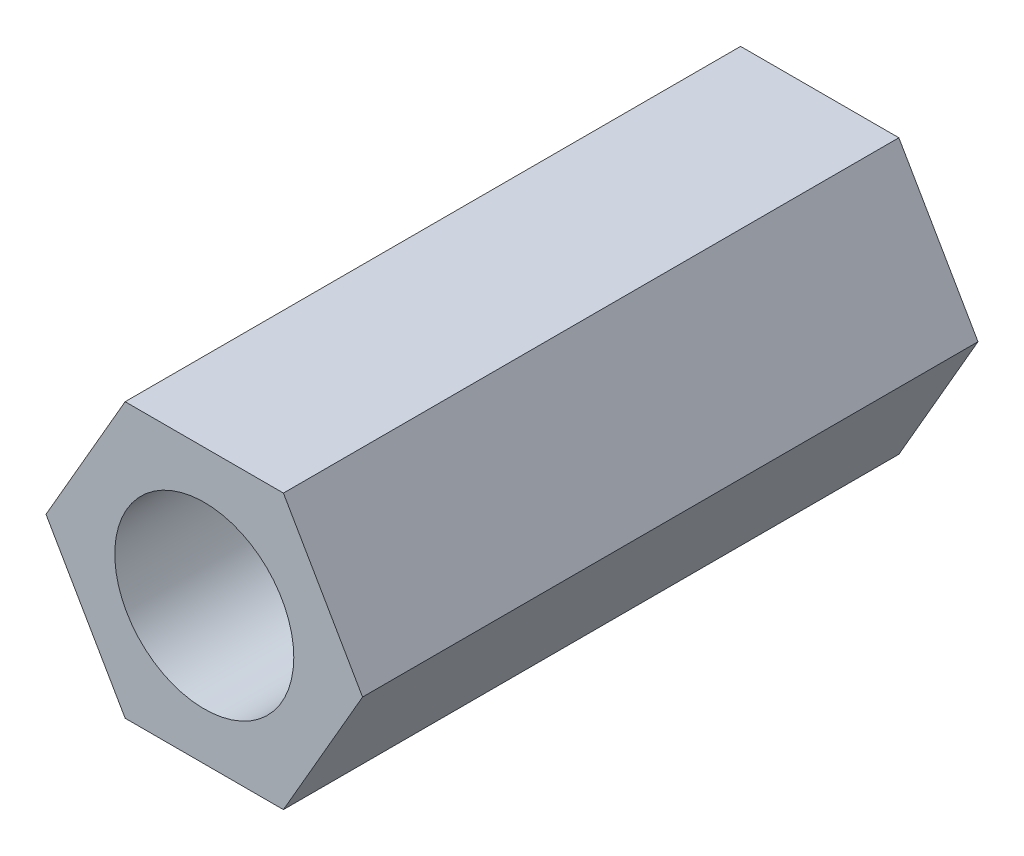
ISO-10303-21;
HEADER;
FILE_DESCRIPTION(('STEP AP214'),'2;1');
FILE_NAME('part.step','',(''),(''),'','','');
FILE_SCHEMA(('AUTOMOTIVE_DESIGN { 1 0 10303 214 1 1 1 1 }'));
ENDSEC;
DATA;
#1=APPLICATION_CONTEXT('core data for automotive mechanical design processes');
#2=APPLICATION_PROTOCOL_DEFINITION('international standard','automotive_design',2000,#1);
#3=PRODUCT_CONTEXT('',#1,'mechanical');
#4=PRODUCT('Part','Part','',(#3));
#5=PRODUCT_RELATED_PRODUCT_CATEGORY('part','',(#4));
#6=PRODUCT_DEFINITION_FORMATION('','',#4);
#7=PRODUCT_DEFINITION_CONTEXT('part definition',#1,'design');
#8=PRODUCT_DEFINITION('design','',#6,#7);
#9=PRODUCT_DEFINITION_SHAPE('','',#8);
#10=(LENGTH_UNIT() NAMED_UNIT(*) SI_UNIT(.MILLI.,.METRE.));
#11=(NAMED_UNIT(*) PLANE_ANGLE_UNIT() SI_UNIT($,.RADIAN.));
#12=(NAMED_UNIT(*) SI_UNIT($,.STERADIAN.) SOLID_ANGLE_UNIT());
#13=UNCERTAINTY_MEASURE_WITH_UNIT(LENGTH_MEASURE(1.E-05),#10,'distance_accuracy_value','');
#14=(GEOMETRIC_REPRESENTATION_CONTEXT(3) GLOBAL_UNCERTAINTY_ASSIGNED_CONTEXT((#13)) GLOBAL_UNIT_ASSIGNED_CONTEXT((#10,
#11,#12)) REPRESENTATION_CONTEXT('',''));
#15=CARTESIAN_POINT('',(0.,0.,0.));
#16=DIRECTION('',(0.,0.,1.));
#17=DIRECTION('',(1.,0.,0.));
#18=AXIS2_PLACEMENT_3D('',#15,#16,#17);
#19=CARTESIAN_POINT('',(0.,0.,11.));
#20=DIRECTION('',(0.,0.,1.));
#21=DIRECTION('',(1.,0.,0.));
#22=AXIS2_PLACEMENT_3D('',#19,#20,#21);
#23=PLANE('',#22);
#24=DIRECTION('',(0.5,0.866025403784439,0.));
#25=VECTOR('',#24,1.);
#26=CARTESIAN_POINT('',(1.41450815951458,-2.45,11.));
#27=LINE('',#26,#25);
#28=CARTESIAN_POINT('',(1.41450815951458,-2.45,11.));
#29=VERTEX_POINT('',#28);
#30=CARTESIAN_POINT('',(2.82901631902917,0.,11.));
#31=VERTEX_POINT('',#30);
#32=EDGE_CURVE('E129',#29,#31,#27,.T.);
#33=ORIENTED_EDGE('',*,*,#32,.T.);
#34=DIRECTION('',(-0.5,0.866025403784439,0.));
#35=VECTOR('',#34,1.);
#36=CARTESIAN_POINT('',(2.82901631902917,0.,11.));
#37=LINE('',#36,#35);
#38=CARTESIAN_POINT('',(1.41450815951458,2.45,11.));
#39=VERTEX_POINT('',#38);
#40=EDGE_CURVE('E87',#31,#39,#37,.T.);
#41=ORIENTED_EDGE('',*,*,#40,.T.);
#42=DIRECTION('',(-1.,0.,0.));
#43=VECTOR('',#42,1.);
#44=CARTESIAN_POINT('',(1.41450815951458,2.45,11.));
#45=LINE('',#44,#43);
#46=CARTESIAN_POINT('',(-1.41450815951458,2.45,11.));
#47=VERTEX_POINT('',#46);
#48=EDGE_CURVE('E100',#39,#47,#45,.T.);
#49=ORIENTED_EDGE('',*,*,#48,.T.);
#50=DIRECTION('',(-0.5,-0.866025403784439,0.));
#51=VECTOR('',#50,1.);
#52=CARTESIAN_POINT('',(-1.41450815951458,2.45,11.));
#53=LINE('',#52,#51);
#54=CARTESIAN_POINT('',(-2.82901631902917,0.,11.));
#55=VERTEX_POINT('',#54);
#56=EDGE_CURVE('E94',#47,#55,#53,.T.);
#57=ORIENTED_EDGE('',*,*,#56,.T.);
#58=DIRECTION('',(0.5,-0.866025403784439,0.));
#59=VECTOR('',#58,1.);
#60=CARTESIAN_POINT('',(-2.82901631902917,0.,11.));
#61=LINE('',#60,#59);
#62=CARTESIAN_POINT('',(-1.41450815951458,-2.45,11.));
#63=VERTEX_POINT('',#62);
#64=EDGE_CURVE('E98',#55,#63,#61,.T.);
#65=ORIENTED_EDGE('',*,*,#64,.T.);
#66=DIRECTION('',(1.,0.,0.));
#67=VECTOR('',#66,1.);
#68=CARTESIAN_POINT('',(-1.41450815951458,-2.45,11.));
#69=LINE('',#68,#67);
#70=EDGE_CURVE('E50',#63,#29,#69,.T.);
#71=ORIENTED_EDGE('',*,*,#70,.T.);
#72=EDGE_LOOP('',(#33,#41,#49,#57,#65,#71));
#73=FACE_BOUND('',#72,.T.);
#74=CARTESIAN_POINT('',(0.,0.,11.));
#75=DIRECTION('',(0.,0.,1.));
#76=DIRECTION('',(1.,0.,0.));
#77=AXIS2_PLACEMENT_3D('',#74,#75,#76);
#78=CIRCLE('',#77,1.6);
#79=CARTESIAN_POINT('',(1.6,0.,11.));
#80=VERTEX_POINT('',#79);
#81=EDGE_CURVE('E122',#80,#80,#78,.T.);
#82=ORIENTED_EDGE('',*,*,#81,.F.);
#83=EDGE_LOOP('',(#82));
#84=FACE_BOUND('',#83,.T.);
#85=ADVANCED_FACE('F33',(#73,#84),#23,.T.);
#86=CARTESIAN_POINT('',(0.,0.,0.));
#87=DIRECTION('',(0.,0.,1.));
#88=DIRECTION('',(1.,0.,0.));
#89=AXIS2_PLACEMENT_3D('',#86,#87,#88);
#90=PLANE('',#89);
#91=DIRECTION('',(0.5,0.866025403784439,0.));
#92=VECTOR('',#91,1.);
#93=CARTESIAN_POINT('',(1.41450815951458,-2.45,0.));
#94=LINE('',#93,#92);
#95=CARTESIAN_POINT('',(1.41450815951458,-2.45,0.));
#96=VERTEX_POINT('',#95);
#97=CARTESIAN_POINT('',(2.82901631902917,0.,0.));
#98=VERTEX_POINT('',#97);
#99=EDGE_CURVE('E118',#96,#98,#94,.T.);
#100=ORIENTED_EDGE('',*,*,#99,.F.);
#101=DIRECTION('',(1.,0.,0.));
#102=VECTOR('',#101,1.);
#103=CARTESIAN_POINT('',(-1.41450815951458,-2.45,0.));
#104=LINE('',#103,#102);
#105=CARTESIAN_POINT('',(-1.41450815951458,-2.45,0.));
#106=VERTEX_POINT('',#105);
#107=EDGE_CURVE('E79',#106,#96,#104,.T.);
#108=ORIENTED_EDGE('',*,*,#107,.F.);
#109=DIRECTION('',(0.5,-0.866025403784439,0.));
#110=VECTOR('',#109,1.);
#111=CARTESIAN_POINT('',(-2.82901631902917,0.,0.));
#112=LINE('',#111,#110);
#113=CARTESIAN_POINT('',(-2.82901631902917,0.,0.));
#114=VERTEX_POINT('',#113);
#115=EDGE_CURVE('E73',#114,#106,#112,.T.);
#116=ORIENTED_EDGE('',*,*,#115,.F.);
#117=DIRECTION('',(-0.5,-0.866025403784439,0.));
#118=VECTOR('',#117,1.);
#119=CARTESIAN_POINT('',(-1.41450815951458,2.45,0.));
#120=LINE('',#119,#118);
#121=CARTESIAN_POINT('',(-1.41450815951458,2.45,0.));
#122=VERTEX_POINT('',#121);
#123=EDGE_CURVE('E108',#122,#114,#120,.T.);
#124=ORIENTED_EDGE('',*,*,#123,.F.);
#125=DIRECTION('',(-1.,0.,0.));
#126=VECTOR('',#125,1.);
#127=CARTESIAN_POINT('',(1.41450815951458,2.45,0.));
#128=LINE('',#127,#126);
#129=CARTESIAN_POINT('',(1.41450815951458,2.45,0.));
#130=VERTEX_POINT('',#129);
#131=EDGE_CURVE('E124',#130,#122,#128,.T.);
#132=ORIENTED_EDGE('',*,*,#131,.F.);
#133=DIRECTION('',(-0.5,0.866025403784439,0.));
#134=VECTOR('',#133,1.);
#135=CARTESIAN_POINT('',(2.82901631902917,0.,0.));
#136=LINE('',#135,#134);
#137=EDGE_CURVE('E121',#98,#130,#136,.T.);
#138=ORIENTED_EDGE('',*,*,#137,.F.);
#139=EDGE_LOOP('',(#100,#108,#116,#124,#132,#138));
#140=FACE_BOUND('',#139,.T.);
#141=CARTESIAN_POINT('',(0.,0.,0.));
#142=DIRECTION('',(0.,0.,1.));
#143=DIRECTION('',(1.,0.,0.));
#144=AXIS2_PLACEMENT_3D('',#141,#142,#143);
#145=CIRCLE('',#144,1.6);
#146=CARTESIAN_POINT('',(1.6,0.,0.));
#147=VERTEX_POINT('',#146);
#148=EDGE_CURVE('E222',#147,#147,#145,.T.);
#149=ORIENTED_EDGE('',*,*,#148,.T.);
#150=EDGE_LOOP('',(#149));
#151=FACE_BOUND('',#150,.T.);
#152=ADVANCED_FACE('F138',(#140,#151),#90,.F.);
#153=CARTESIAN_POINT('',(1.41450815951458,-2.45,11.));
#154=DIRECTION('',(-0.866025403784439,0.5,0.));
#155=DIRECTION('',(-0.5,-0.866025403784439,0.));
#156=AXIS2_PLACEMENT_3D('',#153,#154,#155);
#157=PLANE('',#156);
#158=ORIENTED_EDGE('',*,*,#99,.T.);
#159=DIRECTION('',(0.,0.,-1.));
#160=VECTOR('',#159,1.);
#161=CARTESIAN_POINT('',(2.82901631902917,0.,11.));
#162=LINE('',#161,#160);
#163=EDGE_CURVE('E11',#31,#98,#162,.T.);
#164=ORIENTED_EDGE('',*,*,#163,.F.);
#165=ORIENTED_EDGE('',*,*,#32,.F.);
#166=DIRECTION('',(0.,0.,-1.));
#167=VECTOR('',#166,1.);
#168=CARTESIAN_POINT('',(1.41450815951458,-2.45,11.));
#169=LINE('',#168,#167);
#170=EDGE_CURVE('E114',#29,#96,#169,.T.);
#171=ORIENTED_EDGE('',*,*,#170,.T.);
#172=EDGE_LOOP('',(#158,#164,#165,#171));
#173=FACE_BOUND('',#172,.T.);
#174=ADVANCED_FACE('F35',(#173),#157,.F.);
#175=CARTESIAN_POINT('',(2.82901631902917,0.,11.));
#176=DIRECTION('',(-0.866025403784438,-0.5,0.));
#177=DIRECTION('',(0.5,-0.866025403784439,0.));
#178=AXIS2_PLACEMENT_3D('',#175,#176,#177);
#179=PLANE('',#178);
#180=ORIENTED_EDGE('',*,*,#137,.T.);
#181=DIRECTION('',(0.,0.,-1.));
#182=VECTOR('',#181,1.);
#183=CARTESIAN_POINT('',(1.41450815951458,2.45,11.));
#184=LINE('',#183,#182);
#185=EDGE_CURVE('E42',#39,#130,#184,.T.);
#186=ORIENTED_EDGE('',*,*,#185,.F.);
#187=ORIENTED_EDGE('',*,*,#40,.F.);
#188=ORIENTED_EDGE('',*,*,#163,.T.);
#189=EDGE_LOOP('',(#180,#186,#187,#188));
#190=FACE_BOUND('',#189,.T.);
#191=ADVANCED_FACE('F163',(#190),#179,.F.);
#192=CARTESIAN_POINT('',(1.41450815951458,2.45,11.));
#193=DIRECTION('',(0.,-1.,0.));
#194=DIRECTION('',(0.,0.,-1.));
#195=AXIS2_PLACEMENT_3D('',#192,#193,#194);
#196=PLANE('',#195);
#197=ORIENTED_EDGE('',*,*,#131,.T.);
#198=DIRECTION('',(0.,0.,-1.));
#199=VECTOR('',#198,1.);
#200=CARTESIAN_POINT('',(-1.41450815951458,2.45,11.));
#201=LINE('',#200,#199);
#202=EDGE_CURVE('E109',#47,#122,#201,.T.);
#203=ORIENTED_EDGE('',*,*,#202,.F.);
#204=ORIENTED_EDGE('',*,*,#48,.F.);
#205=ORIENTED_EDGE('',*,*,#185,.T.);
#206=EDGE_LOOP('',(#197,#203,#204,#205));
#207=FACE_BOUND('',#206,.T.);
#208=ADVANCED_FACE('F135',(#207),#196,.F.);
#209=CARTESIAN_POINT('',(-1.41450815951458,2.45,11.));
#210=DIRECTION('',(0.866025403784439,-0.5,0.));
#211=DIRECTION('',(0.5,0.866025403784438,0.));
#212=AXIS2_PLACEMENT_3D('',#209,#210,#211);
#213=PLANE('',#212);
#214=ORIENTED_EDGE('',*,*,#123,.T.);
#215=DIRECTION('',(0.,0.,-1.));
#216=VECTOR('',#215,1.);
#217=CARTESIAN_POINT('',(-2.82901631902917,0.,11.));
#218=LINE('',#217,#216);
#219=EDGE_CURVE('E105',#55,#114,#218,.T.);
#220=ORIENTED_EDGE('',*,*,#219,.F.);
#221=ORIENTED_EDGE('',*,*,#56,.F.);
#222=ORIENTED_EDGE('',*,*,#202,.T.);
#223=EDGE_LOOP('',(#214,#220,#221,#222));
#224=FACE_BOUND('',#223,.T.);
#225=ADVANCED_FACE('F106',(#224),#213,.F.);
#226=CARTESIAN_POINT('',(-2.82901631902917,0.,11.));
#227=DIRECTION('',(0.866025403784438,0.5,0.));
#228=DIRECTION('',(-0.5,0.866025403784438,0.));
#229=AXIS2_PLACEMENT_3D('',#226,#227,#228);
#230=PLANE('',#229);
#231=ORIENTED_EDGE('',*,*,#115,.T.);
#232=DIRECTION('',(0.,0.,-1.));
#233=VECTOR('',#232,1.);
#234=CARTESIAN_POINT('',(-1.41450815951458,-2.45,11.));
#235=LINE('',#234,#233);
#236=EDGE_CURVE('E110',#63,#106,#235,.T.);
#237=ORIENTED_EDGE('',*,*,#236,.F.);
#238=ORIENTED_EDGE('',*,*,#64,.F.);
#239=ORIENTED_EDGE('',*,*,#219,.T.);
#240=EDGE_LOOP('',(#231,#237,#238,#239));
#241=FACE_BOUND('',#240,.T.);
#242=ADVANCED_FACE('F112',(#241),#230,.F.);
#243=CARTESIAN_POINT('',(-1.41450815951458,-2.45,11.));
#244=DIRECTION('',(0.,1.,0.));
#245=DIRECTION('',(0.,0.,1.));
#246=AXIS2_PLACEMENT_3D('',#243,#244,#245);
#247=PLANE('',#246);
#248=ORIENTED_EDGE('',*,*,#107,.T.);
#249=ORIENTED_EDGE('',*,*,#170,.F.);
#250=ORIENTED_EDGE('',*,*,#70,.F.);
#251=ORIENTED_EDGE('',*,*,#236,.T.);
#252=EDGE_LOOP('',(#248,#249,#250,#251));
#253=FACE_BOUND('',#252,.T.);
#254=ADVANCED_FACE('F143',(#253),#247,.F.);
#255=CARTESIAN_POINT('',(0.,0.,11.));
#256=DIRECTION('',(0.,0.,-1.));
#257=DIRECTION('',(-1.,0.,0.));
#258=AXIS2_PLACEMENT_3D('',#255,#256,#257);
#259=CYLINDRICAL_SURFACE('',#258,1.6);
#260=ORIENTED_EDGE('',*,*,#81,.T.);
#261=EDGE_LOOP('',(#260));
#262=FACE_BOUND('',#261,.T.);
#263=ORIENTED_EDGE('',*,*,#148,.F.);
#264=EDGE_LOOP('',(#263));
#265=FACE_BOUND('',#264,.T.);
#266=ADVANCED_FACE('F145',(#262,#265),#259,.F.);
#267=CLOSED_SHELL('',(#85,#152,#174,#191,#208,#225,#242,#254,#266));
#268=MANIFOLD_SOLID_BREP('B2',#267);
#269=ADVANCED_BREP_SHAPE_REPRESENTATION('',(#18,#268),#14);
#270=SHAPE_DEFINITION_REPRESENTATION(#9,#269);
ENDSEC;
END-ISO-10303-21;
